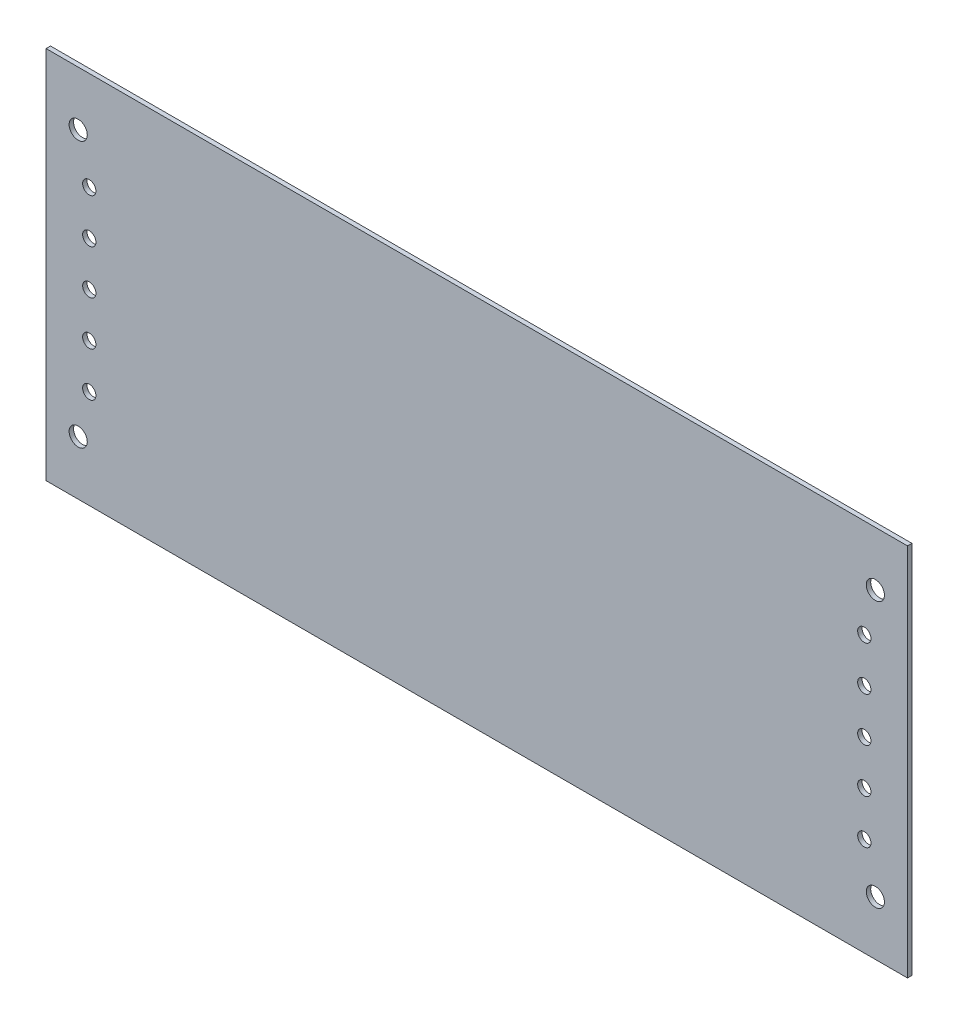
ISO-10303-21;
HEADER;
FILE_DESCRIPTION(('STEP AP214'),'2;1');
FILE_NAME('part.step','',(''),(''),'','','');
FILE_SCHEMA(('AUTOMOTIVE_DESIGN { 1 0 10303 214 1 1 1 1 }'));
ENDSEC;
DATA;
#1=APPLICATION_CONTEXT('core data for automotive mechanical design processes');
#2=APPLICATION_PROTOCOL_DEFINITION('international standard','automotive_design',2000,#1);
#3=PRODUCT_CONTEXT('',#1,'mechanical');
#4=PRODUCT('Part','Part','',(#3));
#5=PRODUCT_RELATED_PRODUCT_CATEGORY('part','',(#4));
#6=PRODUCT_DEFINITION_FORMATION('','',#4);
#7=PRODUCT_DEFINITION_CONTEXT('part definition',#1,'design');
#8=PRODUCT_DEFINITION('design','',#6,#7);
#9=PRODUCT_DEFINITION_SHAPE('','',#8);
#10=(LENGTH_UNIT() NAMED_UNIT(*) SI_UNIT(.MILLI.,.METRE.));
#11=(NAMED_UNIT(*) PLANE_ANGLE_UNIT() SI_UNIT($,.RADIAN.));
#12=(NAMED_UNIT(*) SI_UNIT($,.STERADIAN.) SOLID_ANGLE_UNIT());
#13=UNCERTAINTY_MEASURE_WITH_UNIT(LENGTH_MEASURE(1.E-05),#10,'distance_accuracy_value','');
#14=(GEOMETRIC_REPRESENTATION_CONTEXT(3) GLOBAL_UNCERTAINTY_ASSIGNED_CONTEXT((#13)) GLOBAL_UNIT_ASSIGNED_CONTEXT((#10,
#11,#12)) REPRESENTATION_CONTEXT('',''));
#15=CARTESIAN_POINT('',(0.,0.,0.));
#16=DIRECTION('',(0.,0.,1.));
#17=DIRECTION('',(1.,0.,0.));
#18=AXIS2_PLACEMENT_3D('',#15,#16,#17);
#19=CARTESIAN_POINT('',(-194.5,-84.5,2.));
#20=DIRECTION('',(1.,0.,0.));
#21=DIRECTION('',(0.,0.,-1.));
#22=AXIS2_PLACEMENT_3D('',#19,#20,#21);
#23=PLANE('',#22);
#24=DIRECTION('',(0.,-1.,0.));
#25=VECTOR('',#24,1.);
#26=CARTESIAN_POINT('',(-194.5,-84.5,0.));
#27=LINE('',#26,#25);
#28=CARTESIAN_POINT('',(-194.5,84.5,0.));
#29=VERTEX_POINT('',#28);
#30=CARTESIAN_POINT('',(-194.5,-84.5,0.));
#31=VERTEX_POINT('',#30);
#32=EDGE_CURVE('E110',#29,#31,#27,.T.);
#33=ORIENTED_EDGE('',*,*,#32,.T.);
#34=DIRECTION('',(0.,0.,-1.));
#35=VECTOR('',#34,1.);
#36=CARTESIAN_POINT('',(-194.5,-84.5,2.));
#37=LINE('',#36,#35);
#38=CARTESIAN_POINT('',(-194.5,-84.5,2.));
#39=VERTEX_POINT('',#38);
#40=EDGE_CURVE('E11',#39,#31,#37,.T.);
#41=ORIENTED_EDGE('',*,*,#40,.F.);
#42=DIRECTION('',(0.,-1.,0.));
#43=VECTOR('',#42,1.);
#44=CARTESIAN_POINT('',(-194.5,-84.5,2.));
#45=LINE('',#44,#43);
#46=CARTESIAN_POINT('',(-194.5,84.5,2.));
#47=VERTEX_POINT('',#46);
#48=EDGE_CURVE('E94',#47,#39,#45,.T.);
#49=ORIENTED_EDGE('',*,*,#48,.F.);
#50=DIRECTION('',(0.,0.,-1.));
#51=VECTOR('',#50,1.);
#52=CARTESIAN_POINT('',(-194.5,84.5,2.));
#53=LINE('',#52,#51);
#54=EDGE_CURVE('E106',#47,#29,#53,.T.);
#55=ORIENTED_EDGE('',*,*,#54,.T.);
#56=EDGE_LOOP('',(#33,#41,#49,#55));
#57=FACE_BOUND('',#56,.T.);
#58=ADVANCED_FACE('F42',(#57),#23,.F.);
#59=CARTESIAN_POINT('',(194.5,-84.5,2.));
#60=DIRECTION('',(0.,1.,0.));
#61=DIRECTION('',(-1.,0.,0.));
#62=AXIS2_PLACEMENT_3D('',#59,#60,#61);
#63=PLANE('',#62);
#64=DIRECTION('',(1.,0.,0.));
#65=VECTOR('',#64,1.);
#66=CARTESIAN_POINT('',(194.5,-84.5,0.));
#67=LINE('',#66,#65);
#68=CARTESIAN_POINT('',(194.5,-84.5,0.));
#69=VERTEX_POINT('',#68);
#70=EDGE_CURVE('E99',#31,#69,#67,.T.);
#71=ORIENTED_EDGE('',*,*,#70,.T.);
#72=DIRECTION('',(0.,0.,-1.));
#73=VECTOR('',#72,1.);
#74=CARTESIAN_POINT('',(194.5,-84.5,2.));
#75=LINE('',#74,#73);
#76=CARTESIAN_POINT('',(194.5,-84.5,2.));
#77=VERTEX_POINT('',#76);
#78=EDGE_CURVE('E51',#77,#69,#75,.T.);
#79=ORIENTED_EDGE('',*,*,#78,.F.);
#80=DIRECTION('',(1.,0.,0.));
#81=VECTOR('',#80,1.);
#82=CARTESIAN_POINT('',(194.5,-84.5,2.));
#83=LINE('',#82,#81);
#84=EDGE_CURVE('E89',#39,#77,#83,.T.);
#85=ORIENTED_EDGE('',*,*,#84,.F.);
#86=ORIENTED_EDGE('',*,*,#40,.T.);
#87=EDGE_LOOP('',(#71,#79,#85,#86));
#88=FACE_BOUND('',#87,.T.);
#89=ADVANCED_FACE('F98',(#88),#63,.F.);
#90=CARTESIAN_POINT('',(194.5,-84.5,2.));
#91=DIRECTION('',(-1.,0.,0.));
#92=DIRECTION('',(0.,0.,1.));
#93=AXIS2_PLACEMENT_3D('',#90,#91,#92);
#94=PLANE('',#93);
#95=DIRECTION('',(0.,1.,0.));
#96=VECTOR('',#95,1.);
#97=CARTESIAN_POINT('',(194.5,-84.5,0.));
#98=LINE('',#97,#96);
#99=CARTESIAN_POINT('',(194.5,84.5000000000001,0.));
#100=VERTEX_POINT('',#99);
#101=EDGE_CURVE('E76',#69,#100,#98,.T.);
#102=ORIENTED_EDGE('',*,*,#101,.T.);
#103=DIRECTION('',(0.,0.,-1.));
#104=VECTOR('',#103,1.);
#105=CARTESIAN_POINT('',(194.5,84.5000000000001,2.));
#106=LINE('',#105,#104);
#107=CARTESIAN_POINT('',(194.5,84.5000000000001,2.));
#108=VERTEX_POINT('',#107);
#109=EDGE_CURVE('E101',#108,#100,#106,.T.);
#110=ORIENTED_EDGE('',*,*,#109,.F.);
#111=DIRECTION('',(0.,1.,0.));
#112=VECTOR('',#111,1.);
#113=CARTESIAN_POINT('',(194.5,-84.5,2.));
#114=LINE('',#113,#112);
#115=EDGE_CURVE('E92',#77,#108,#114,.T.);
#116=ORIENTED_EDGE('',*,*,#115,.F.);
#117=ORIENTED_EDGE('',*,*,#78,.T.);
#118=EDGE_LOOP('',(#102,#110,#116,#117));
#119=FACE_BOUND('',#118,.T.);
#120=ADVANCED_FACE('F102',(#119),#94,.F.);
#121=CARTESIAN_POINT('',(194.5,84.5000000000001,2.));
#122=DIRECTION('',(0.,-1.,0.));
#123=DIRECTION('',(1.,0.,0.));
#124=AXIS2_PLACEMENT_3D('',#121,#122,#123);
#125=PLANE('',#124);
#126=DIRECTION('',(-1.,0.,0.));
#127=VECTOR('',#126,1.);
#128=CARTESIAN_POINT('',(194.5,84.5000000000001,0.));
#129=LINE('',#128,#127);
#130=EDGE_CURVE('E82',#100,#29,#129,.T.);
#131=ORIENTED_EDGE('',*,*,#130,.T.);
#132=ORIENTED_EDGE('',*,*,#54,.F.);
#133=DIRECTION('',(-1.,0.,0.));
#134=VECTOR('',#133,1.);
#135=CARTESIAN_POINT('',(194.5,84.5000000000001,2.));
#136=LINE('',#135,#134);
#137=EDGE_CURVE('E59',#108,#47,#136,.T.);
#138=ORIENTED_EDGE('',*,*,#137,.F.);
#139=ORIENTED_EDGE('',*,*,#109,.T.);
#140=EDGE_LOOP('',(#131,#132,#138,#139));
#141=FACE_BOUND('',#140,.T.);
#142=ADVANCED_FACE('F124',(#141),#125,.F.);
#143=CARTESIAN_POINT('',(0.,0.,2.));
#144=DIRECTION('',(0.,0.,1.));
#145=DIRECTION('',(1.,0.,0.));
#146=AXIS2_PLACEMENT_3D('',#143,#144,#145);
#147=PLANE('',#146);
#148=CARTESIAN_POINT('',(175.,40.,2.));
#149=DIRECTION('',(0.,0.,1.));
#150=DIRECTION('',(1.,0.,0.));
#151=AXIS2_PLACEMENT_3D('',#148,#149,#150);
#152=CIRCLE('',#151,2.99999999999999);
#153=CARTESIAN_POINT('',(178.,40.,2.));
#154=VERTEX_POINT('',#153);
#155=EDGE_CURVE('E160',#154,#154,#152,.T.);
#156=ORIENTED_EDGE('',*,*,#155,.F.);
#157=EDGE_LOOP('',(#156));
#158=FACE_BOUND('',#157,.T.);
#159=CARTESIAN_POINT('',(-180.,60.0000000000004,2.));
#160=DIRECTION('',(0.,0.,1.));
#161=DIRECTION('',(1.,0.,0.));
#162=AXIS2_PLACEMENT_3D('',#159,#160,#161);
#163=CIRCLE('',#162,4.09999999999999);
#164=CARTESIAN_POINT('',(-175.9,60.0000000000004,2.));
#165=VERTEX_POINT('',#164);
#166=EDGE_CURVE('E175',#165,#165,#163,.T.);
#167=ORIENTED_EDGE('',*,*,#166,.F.);
#168=EDGE_LOOP('',(#167));
#169=FACE_BOUND('',#168,.T.);
#170=CARTESIAN_POINT('',(180.,60.0000000000004,2.));
#171=DIRECTION('',(0.,0.,1.));
#172=DIRECTION('',(1.,0.,0.));
#173=AXIS2_PLACEMENT_3D('',#170,#171,#172);
#174=CIRCLE('',#173,4.09999999999999);
#175=CARTESIAN_POINT('',(184.1,60.0000000000004,2.));
#176=VERTEX_POINT('',#175);
#177=EDGE_CURVE('E176',#176,#176,#174,.T.);
#178=ORIENTED_EDGE('',*,*,#177,.F.);
#179=EDGE_LOOP('',(#178));
#180=FACE_BOUND('',#179,.T.);
#181=CARTESIAN_POINT('',(-175.,-19.9999999999996,2.));
#182=DIRECTION('',(0.,0.,1.));
#183=DIRECTION('',(1.,0.,0.));
#184=AXIS2_PLACEMENT_3D('',#181,#182,#183);
#185=CIRCLE('',#184,2.99999999999994);
#186=CARTESIAN_POINT('',(-172.,-19.9999999999996,2.));
#187=VERTEX_POINT('',#186);
#188=EDGE_CURVE('E191',#187,#187,#185,.T.);
#189=ORIENTED_EDGE('',*,*,#188,.F.);
#190=EDGE_LOOP('',(#189));
#191=FACE_BOUND('',#190,.T.);
#192=CARTESIAN_POINT('',(175.,0.,2.));
#193=DIRECTION('',(0.,0.,1.));
#194=DIRECTION('',(1.,0.,0.));
#195=AXIS2_PLACEMENT_3D('',#192,#193,#194);
#196=CIRCLE('',#195,2.99999999999999);
#197=CARTESIAN_POINT('',(178.,0.,2.));
#198=VERTEX_POINT('',#197);
#199=EDGE_CURVE('E135',#198,#198,#196,.T.);
#200=ORIENTED_EDGE('',*,*,#199,.F.);
#201=EDGE_LOOP('',(#200));
#202=FACE_BOUND('',#201,.T.);
#203=CARTESIAN_POINT('',(-175.,20.0000000000004,2.));
#204=DIRECTION('',(0.,0.,1.));
#205=DIRECTION('',(1.,0.,0.));
#206=AXIS2_PLACEMENT_3D('',#203,#204,#205);
#207=CIRCLE('',#206,3.00000000000005);
#208=CARTESIAN_POINT('',(-172.,20.0000000000004,2.));
#209=VERTEX_POINT('',#208);
#210=EDGE_CURVE('E143',#209,#209,#207,.T.);
#211=ORIENTED_EDGE('',*,*,#210,.F.);
#212=EDGE_LOOP('',(#211));
#213=FACE_BOUND('',#212,.T.);
#214=CARTESIAN_POINT('',(175.,20.,2.));
#215=DIRECTION('',(0.,0.,1.));
#216=DIRECTION('',(1.,0.,0.));
#217=AXIS2_PLACEMENT_3D('',#214,#215,#216);
#218=CIRCLE('',#217,2.99999999999999);
#219=CARTESIAN_POINT('',(178.,20.,2.));
#220=VERTEX_POINT('',#219);
#221=EDGE_CURVE('E144',#220,#220,#218,.T.);
#222=ORIENTED_EDGE('',*,*,#221,.F.);
#223=EDGE_LOOP('',(#222));
#224=FACE_BOUND('',#223,.T.);
#225=CARTESIAN_POINT('',(-175.,40.0000000000004,2.));
#226=DIRECTION('',(0.,0.,1.));
#227=DIRECTION('',(1.,0.,0.));
#228=AXIS2_PLACEMENT_3D('',#225,#226,#227);
#229=CIRCLE('',#228,2.99999999999999);
#230=CARTESIAN_POINT('',(-172.,40.0000000000004,2.));
#231=VERTEX_POINT('',#230);
#232=EDGE_CURVE('E159',#231,#231,#229,.T.);
#233=ORIENTED_EDGE('',*,*,#232,.F.);
#234=EDGE_LOOP('',(#233));
#235=FACE_BOUND('',#234,.T.);
#236=CARTESIAN_POINT('',(180.,-60.,2.));
#237=DIRECTION('',(0.,0.,1.));
#238=DIRECTION('',(1.,0.,0.));
#239=AXIS2_PLACEMENT_3D('',#236,#237,#238);
#240=CIRCLE('',#239,4.09999999999999);
#241=CARTESIAN_POINT('',(184.1,-60.,2.));
#242=VERTEX_POINT('',#241);
#243=EDGE_CURVE('E224',#242,#242,#240,.T.);
#244=ORIENTED_EDGE('',*,*,#243,.F.);
#245=EDGE_LOOP('',(#244));
#246=FACE_BOUND('',#245,.T.);
#247=CARTESIAN_POINT('',(175.,-20.,2.));
#248=DIRECTION('',(0.,0.,1.));
#249=DIRECTION('',(1.,0.,0.));
#250=AXIS2_PLACEMENT_3D('',#247,#248,#249);
#251=CIRCLE('',#250,2.99999999999999);
#252=CARTESIAN_POINT('',(178.,-20.,2.));
#253=VERTEX_POINT('',#252);
#254=EDGE_CURVE('E192',#253,#253,#251,.T.);
#255=ORIENTED_EDGE('',*,*,#254,.F.);
#256=EDGE_LOOP('',(#255));
#257=FACE_BOUND('',#256,.T.);
#258=CARTESIAN_POINT('',(-175.,-39.9999999999996,2.));
#259=DIRECTION('',(0.,0.,1.));
#260=DIRECTION('',(1.,0.,0.));
#261=AXIS2_PLACEMENT_3D('',#258,#259,#260);
#262=CIRCLE('',#261,2.99999999999999);
#263=CARTESIAN_POINT('',(-172.,-39.9999999999996,2.));
#264=VERTEX_POINT('',#263);
#265=EDGE_CURVE('E207',#264,#264,#262,.T.);
#266=ORIENTED_EDGE('',*,*,#265,.F.);
#267=EDGE_LOOP('',(#266));
#268=FACE_BOUND('',#267,.T.);
#269=CARTESIAN_POINT('',(175.,-40.,2.));
#270=DIRECTION('',(0.,0.,1.));
#271=DIRECTION('',(1.,0.,0.));
#272=AXIS2_PLACEMENT_3D('',#269,#270,#271);
#273=CIRCLE('',#272,2.99999999999999);
#274=CARTESIAN_POINT('',(178.,-40.,2.));
#275=VERTEX_POINT('',#274);
#276=EDGE_CURVE('E208',#275,#275,#273,.T.);
#277=ORIENTED_EDGE('',*,*,#276,.F.);
#278=EDGE_LOOP('',(#277));
#279=FACE_BOUND('',#278,.T.);
#280=CARTESIAN_POINT('',(-180.,-59.9999999999996,2.));
#281=DIRECTION('',(0.,0.,1.));
#282=DIRECTION('',(1.,0.,0.));
#283=AXIS2_PLACEMENT_3D('',#280,#281,#282);
#284=CIRCLE('',#283,4.09999999999999);
#285=CARTESIAN_POINT('',(-175.9,-59.9999999999996,2.));
#286=VERTEX_POINT('',#285);
#287=EDGE_CURVE('E223',#286,#286,#284,.T.);
#288=ORIENTED_EDGE('',*,*,#287,.F.);
#289=EDGE_LOOP('',(#288));
#290=FACE_BOUND('',#289,.T.);
#291=CARTESIAN_POINT('',(-175.,4.02455846426619E-13,2.));
#292=DIRECTION('',(0.,0.,1.));
#293=DIRECTION('',(1.,0.,0.));
#294=AXIS2_PLACEMENT_3D('',#291,#292,#293);
#295=CIRCLE('',#294,2.99999999999994);
#296=CARTESIAN_POINT('',(-172.,4.02455846426619E-13,2.));
#297=VERTEX_POINT('',#296);
#298=EDGE_CURVE('E131',#297,#297,#295,.T.);
#299=ORIENTED_EDGE('',*,*,#298,.F.);
#300=EDGE_LOOP('',(#299));
#301=FACE_BOUND('',#300,.T.);
#302=ORIENTED_EDGE('',*,*,#48,.T.);
#303=ORIENTED_EDGE('',*,*,#84,.T.);
#304=ORIENTED_EDGE('',*,*,#115,.T.);
#305=ORIENTED_EDGE('',*,*,#137,.T.);
#306=EDGE_LOOP('',(#302,#303,#304,#305));
#307=FACE_BOUND('',#306,.T.);
#308=ADVANCED_FACE('F90',(#158,#169,#180,#191,#202,#213,#224,#235,#246,#257,#268,#279,#290,#301,
#307),#147,.T.);
#309=CARTESIAN_POINT('',(0.,0.,0.));
#310=DIRECTION('',(0.,0.,1.));
#311=DIRECTION('',(1.,0.,0.));
#312=AXIS2_PLACEMENT_3D('',#309,#310,#311);
#313=PLANE('',#312);
#314=CARTESIAN_POINT('',(175.,40.,0.));
#315=DIRECTION('',(0.,0.,1.));
#316=DIRECTION('',(1.,0.,0.));
#317=AXIS2_PLACEMENT_3D('',#314,#315,#316);
#318=CIRCLE('',#317,2.99999999999999);
#319=CARTESIAN_POINT('',(178.,40.,0.));
#320=VERTEX_POINT('',#319);
#321=EDGE_CURVE('E180',#320,#320,#318,.T.);
#322=ORIENTED_EDGE('',*,*,#321,.T.);
#323=EDGE_LOOP('',(#322));
#324=FACE_BOUND('',#323,.T.);
#325=CARTESIAN_POINT('',(-180.,60.0000000000004,0.));
#326=DIRECTION('',(0.,0.,1.));
#327=DIRECTION('',(1.,0.,0.));
#328=AXIS2_PLACEMENT_3D('',#325,#326,#327);
#329=CIRCLE('',#328,4.09999999999999);
#330=CARTESIAN_POINT('',(-175.9,60.0000000000004,0.));
#331=VERTEX_POINT('',#330);
#332=EDGE_CURVE('E171',#331,#331,#329,.T.);
#333=ORIENTED_EDGE('',*,*,#332,.T.);
#334=EDGE_LOOP('',(#333));
#335=FACE_BOUND('',#334,.T.);
#336=CARTESIAN_POINT('',(180.,60.0000000000004,0.));
#337=DIRECTION('',(0.,0.,1.));
#338=DIRECTION('',(1.,0.,0.));
#339=AXIS2_PLACEMENT_3D('',#336,#337,#338);
#340=CIRCLE('',#339,4.09999999999999);
#341=CARTESIAN_POINT('',(184.1,60.0000000000004,0.));
#342=VERTEX_POINT('',#341);
#343=EDGE_CURVE('E196',#342,#342,#340,.T.);
#344=ORIENTED_EDGE('',*,*,#343,.T.);
#345=EDGE_LOOP('',(#344));
#346=FACE_BOUND('',#345,.T.);
#347=CARTESIAN_POINT('',(-175.,-19.9999999999996,0.));
#348=DIRECTION('',(0.,0.,1.));
#349=DIRECTION('',(1.,0.,0.));
#350=AXIS2_PLACEMENT_3D('',#347,#348,#349);
#351=CIRCLE('',#350,2.99999999999994);
#352=CARTESIAN_POINT('',(-172.,-19.9999999999996,0.));
#353=VERTEX_POINT('',#352);
#354=EDGE_CURVE('E187',#353,#353,#351,.T.);
#355=ORIENTED_EDGE('',*,*,#354,.T.);
#356=EDGE_LOOP('',(#355));
#357=FACE_BOUND('',#356,.T.);
#358=CARTESIAN_POINT('',(175.,0.,0.));
#359=DIRECTION('',(0.,0.,1.));
#360=DIRECTION('',(1.,0.,0.));
#361=AXIS2_PLACEMENT_3D('',#358,#359,#360);
#362=CIRCLE('',#361,2.99999999999999);
#363=CARTESIAN_POINT('',(178.,0.,0.));
#364=VERTEX_POINT('',#363);
#365=EDGE_CURVE('E148',#364,#364,#362,.T.);
#366=ORIENTED_EDGE('',*,*,#365,.T.);
#367=EDGE_LOOP('',(#366));
#368=FACE_BOUND('',#367,.T.);
#369=CARTESIAN_POINT('',(-175.,20.0000000000004,0.));
#370=DIRECTION('',(0.,0.,1.));
#371=DIRECTION('',(1.,0.,0.));
#372=AXIS2_PLACEMENT_3D('',#369,#370,#371);
#373=CIRCLE('',#372,3.00000000000005);
#374=CARTESIAN_POINT('',(-172.,20.0000000000004,0.));
#375=VERTEX_POINT('',#374);
#376=EDGE_CURVE('E139',#375,#375,#373,.T.);
#377=ORIENTED_EDGE('',*,*,#376,.T.);
#378=EDGE_LOOP('',(#377));
#379=FACE_BOUND('',#378,.T.);
#380=CARTESIAN_POINT('',(175.,20.,0.));
#381=DIRECTION('',(0.,0.,1.));
#382=DIRECTION('',(1.,0.,0.));
#383=AXIS2_PLACEMENT_3D('',#380,#381,#382);
#384=CIRCLE('',#383,2.99999999999999);
#385=CARTESIAN_POINT('',(178.,20.,0.));
#386=VERTEX_POINT('',#385);
#387=EDGE_CURVE('E164',#386,#386,#384,.T.);
#388=ORIENTED_EDGE('',*,*,#387,.T.);
#389=EDGE_LOOP('',(#388));
#390=FACE_BOUND('',#389,.T.);
#391=CARTESIAN_POINT('',(-175.,40.0000000000004,0.));
#392=DIRECTION('',(0.,0.,1.));
#393=DIRECTION('',(1.,0.,0.));
#394=AXIS2_PLACEMENT_3D('',#391,#392,#393);
#395=CIRCLE('',#394,2.99999999999999);
#396=CARTESIAN_POINT('',(-172.,40.0000000000004,0.));
#397=VERTEX_POINT('',#396);
#398=EDGE_CURVE('E155',#397,#397,#395,.T.);
#399=ORIENTED_EDGE('',*,*,#398,.T.);
#400=EDGE_LOOP('',(#399));
#401=FACE_BOUND('',#400,.T.);
#402=CARTESIAN_POINT('',(180.,-60.,0.));
#403=DIRECTION('',(0.,0.,1.));
#404=DIRECTION('',(1.,0.,0.));
#405=AXIS2_PLACEMENT_3D('',#402,#403,#404);
#406=CIRCLE('',#405,4.09999999999999);
#407=CARTESIAN_POINT('',(184.1,-60.,0.));
#408=VERTEX_POINT('',#407);
#409=EDGE_CURVE('E235',#408,#408,#406,.T.);
#410=ORIENTED_EDGE('',*,*,#409,.T.);
#411=EDGE_LOOP('',(#410));
#412=FACE_BOUND('',#411,.T.);
#413=CARTESIAN_POINT('',(175.,-20.,0.));
#414=DIRECTION('',(0.,0.,1.));
#415=DIRECTION('',(1.,0.,0.));
#416=AXIS2_PLACEMENT_3D('',#413,#414,#415);
#417=CIRCLE('',#416,2.99999999999999);
#418=CARTESIAN_POINT('',(178.,-20.,0.));
#419=VERTEX_POINT('',#418);
#420=EDGE_CURVE('E212',#419,#419,#417,.T.);
#421=ORIENTED_EDGE('',*,*,#420,.T.);
#422=EDGE_LOOP('',(#421));
#423=FACE_BOUND('',#422,.T.);
#424=CARTESIAN_POINT('',(-175.,-39.9999999999996,0.));
#425=DIRECTION('',(0.,0.,1.));
#426=DIRECTION('',(1.,0.,0.));
#427=AXIS2_PLACEMENT_3D('',#424,#425,#426);
#428=CIRCLE('',#427,2.99999999999999);
#429=CARTESIAN_POINT('',(-172.,-39.9999999999996,0.));
#430=VERTEX_POINT('',#429);
#431=EDGE_CURVE('E203',#430,#430,#428,.T.);
#432=ORIENTED_EDGE('',*,*,#431,.T.);
#433=EDGE_LOOP('',(#432));
#434=FACE_BOUND('',#433,.T.);
#435=CARTESIAN_POINT('',(175.,-40.,0.));
#436=DIRECTION('',(0.,0.,1.));
#437=DIRECTION('',(1.,0.,0.));
#438=AXIS2_PLACEMENT_3D('',#435,#436,#437);
#439=CIRCLE('',#438,2.99999999999999);
#440=CARTESIAN_POINT('',(178.,-40.,0.));
#441=VERTEX_POINT('',#440);
#442=EDGE_CURVE('E228',#441,#441,#439,.T.);
#443=ORIENTED_EDGE('',*,*,#442,.T.);
#444=EDGE_LOOP('',(#443));
#445=FACE_BOUND('',#444,.T.);
#446=CARTESIAN_POINT('',(-180.,-59.9999999999996,0.));
#447=DIRECTION('',(0.,0.,1.));
#448=DIRECTION('',(1.,0.,0.));
#449=AXIS2_PLACEMENT_3D('',#446,#447,#448);
#450=CIRCLE('',#449,4.09999999999999);
#451=CARTESIAN_POINT('',(-175.9,-59.9999999999996,0.));
#452=VERTEX_POINT('',#451);
#453=EDGE_CURVE('E219',#452,#452,#450,.T.);
#454=ORIENTED_EDGE('',*,*,#453,.T.);
#455=EDGE_LOOP('',(#454));
#456=FACE_BOUND('',#455,.T.);
#457=CARTESIAN_POINT('',(-175.,4.02455846426619E-13,0.));
#458=DIRECTION('',(0.,0.,1.));
#459=DIRECTION('',(1.,0.,0.));
#460=AXIS2_PLACEMENT_3D('',#457,#458,#459);
#461=CIRCLE('',#460,2.99999999999994);
#462=CARTESIAN_POINT('',(-172.,4.02455846426619E-13,0.));
#463=VERTEX_POINT('',#462);
#464=EDGE_CURVE('E114',#463,#463,#461,.T.);
#465=ORIENTED_EDGE('',*,*,#464,.T.);
#466=EDGE_LOOP('',(#465));
#467=FACE_BOUND('',#466,.T.);
#468=ORIENTED_EDGE('',*,*,#32,.F.);
#469=ORIENTED_EDGE('',*,*,#130,.F.);
#470=ORIENTED_EDGE('',*,*,#101,.F.);
#471=ORIENTED_EDGE('',*,*,#70,.F.);
#472=EDGE_LOOP('',(#468,#469,#470,#471));
#473=FACE_BOUND('',#472,.T.);
#474=ADVANCED_FACE('F127',(#324,#335,#346,#357,#368,#379,#390,#401,#412,#423,#434,#445,#456,
#467,#473),#313,.F.);
#475=CARTESIAN_POINT('',(-175.,4.02455846426619E-13,0.));
#476=DIRECTION('',(0.,0.,1.));
#477=DIRECTION('',(1.,0.,0.));
#478=AXIS2_PLACEMENT_3D('',#475,#476,#477);
#479=CYLINDRICAL_SURFACE('',#478,2.99999999999994);
#480=ORIENTED_EDGE('',*,*,#464,.F.);
#481=EDGE_LOOP('',(#480));
#482=FACE_BOUND('',#481,.T.);
#483=ORIENTED_EDGE('',*,*,#298,.T.);
#484=EDGE_LOOP('',(#483));
#485=FACE_BOUND('',#484,.T.);
#486=ADVANCED_FACE('F259',(#482,#485),#479,.F.);
#487=CARTESIAN_POINT('',(-180.,-59.9999999999996,0.));
#488=DIRECTION('',(0.,0.,1.));
#489=DIRECTION('',(1.,0.,0.));
#490=AXIS2_PLACEMENT_3D('',#487,#488,#489);
#491=CYLINDRICAL_SURFACE('',#490,4.09999999999999);
#492=ORIENTED_EDGE('',*,*,#453,.F.);
#493=EDGE_LOOP('',(#492));
#494=FACE_BOUND('',#493,.T.);
#495=ORIENTED_EDGE('',*,*,#287,.T.);
#496=EDGE_LOOP('',(#495));
#497=FACE_BOUND('',#496,.T.);
#498=ADVANCED_FACE('F261',(#494,#497),#491,.F.);
#499=CARTESIAN_POINT('',(175.,-40.,0.));
#500=DIRECTION('',(0.,0.,1.));
#501=DIRECTION('',(1.,0.,0.));
#502=AXIS2_PLACEMENT_3D('',#499,#500,#501);
#503=CYLINDRICAL_SURFACE('',#502,2.99999999999999);
#504=ORIENTED_EDGE('',*,*,#442,.F.);
#505=EDGE_LOOP('',(#504));
#506=FACE_BOUND('',#505,.T.);
#507=ORIENTED_EDGE('',*,*,#276,.T.);
#508=EDGE_LOOP('',(#507));
#509=FACE_BOUND('',#508,.T.);
#510=ADVANCED_FACE('F268',(#506,#509),#503,.F.);
#511=CARTESIAN_POINT('',(-175.,-39.9999999999996,0.));
#512=DIRECTION('',(0.,0.,1.));
#513=DIRECTION('',(1.,0.,0.));
#514=AXIS2_PLACEMENT_3D('',#511,#512,#513);
#515=CYLINDRICAL_SURFACE('',#514,2.99999999999999);
#516=ORIENTED_EDGE('',*,*,#431,.F.);
#517=EDGE_LOOP('',(#516));
#518=FACE_BOUND('',#517,.T.);
#519=ORIENTED_EDGE('',*,*,#265,.T.);
#520=EDGE_LOOP('',(#519));
#521=FACE_BOUND('',#520,.T.);
#522=ADVANCED_FACE('F319',(#518,#521),#515,.F.);
#523=CARTESIAN_POINT('',(175.,-20.,0.));
#524=DIRECTION('',(0.,0.,1.));
#525=DIRECTION('',(1.,0.,0.));
#526=AXIS2_PLACEMENT_3D('',#523,#524,#525);
#527=CYLINDRICAL_SURFACE('',#526,2.99999999999999);
#528=ORIENTED_EDGE('',*,*,#420,.F.);
#529=EDGE_LOOP('',(#528));
#530=FACE_BOUND('',#529,.T.);
#531=ORIENTED_EDGE('',*,*,#254,.T.);
#532=EDGE_LOOP('',(#531));
#533=FACE_BOUND('',#532,.T.);
#534=ADVANCED_FACE('F330',(#530,#533),#527,.F.);
#535=CARTESIAN_POINT('',(180.,-60.,0.));
#536=DIRECTION('',(0.,0.,1.));
#537=DIRECTION('',(1.,0.,0.));
#538=AXIS2_PLACEMENT_3D('',#535,#536,#537);
#539=CYLINDRICAL_SURFACE('',#538,4.09999999999999);
#540=ORIENTED_EDGE('',*,*,#409,.F.);
#541=EDGE_LOOP('',(#540));
#542=FACE_BOUND('',#541,.T.);
#543=ORIENTED_EDGE('',*,*,#243,.T.);
#544=EDGE_LOOP('',(#543));
#545=FACE_BOUND('',#544,.T.);
#546=ADVANCED_FACE('F243',(#542,#545),#539,.F.);
#547=CARTESIAN_POINT('',(-175.,40.0000000000004,0.));
#548=DIRECTION('',(0.,0.,1.));
#549=DIRECTION('',(1.,0.,0.));
#550=AXIS2_PLACEMENT_3D('',#547,#548,#549);
#551=CYLINDRICAL_SURFACE('',#550,2.99999999999999);
#552=ORIENTED_EDGE('',*,*,#398,.F.);
#553=EDGE_LOOP('',(#552));
#554=FACE_BOUND('',#553,.T.);
#555=ORIENTED_EDGE('',*,*,#232,.T.);
#556=EDGE_LOOP('',(#555));
#557=FACE_BOUND('',#556,.T.);
#558=ADVANCED_FACE('F351',(#554,#557),#551,.F.);
#559=CARTESIAN_POINT('',(175.,20.,0.));
#560=DIRECTION('',(0.,0.,1.));
#561=DIRECTION('',(1.,0.,0.));
#562=AXIS2_PLACEMENT_3D('',#559,#560,#561);
#563=CYLINDRICAL_SURFACE('',#562,2.99999999999999);
#564=ORIENTED_EDGE('',*,*,#387,.F.);
#565=EDGE_LOOP('',(#564));
#566=FACE_BOUND('',#565,.T.);
#567=ORIENTED_EDGE('',*,*,#221,.T.);
#568=EDGE_LOOP('',(#567));
#569=FACE_BOUND('',#568,.T.);
#570=ADVANCED_FACE('F362',(#566,#569),#563,.F.);
#571=CARTESIAN_POINT('',(-175.,20.0000000000004,0.));
#572=DIRECTION('',(0.,0.,1.));
#573=DIRECTION('',(1.,0.,0.));
#574=AXIS2_PLACEMENT_3D('',#571,#572,#573);
#575=CYLINDRICAL_SURFACE('',#574,3.00000000000005);
#576=ORIENTED_EDGE('',*,*,#376,.F.);
#577=EDGE_LOOP('',(#576));
#578=FACE_BOUND('',#577,.T.);
#579=ORIENTED_EDGE('',*,*,#210,.T.);
#580=EDGE_LOOP('',(#579));
#581=FACE_BOUND('',#580,.T.);
#582=ADVANCED_FACE('F373',(#578,#581),#575,.F.);
#583=CARTESIAN_POINT('',(175.,0.,0.));
#584=DIRECTION('',(0.,0.,1.));
#585=DIRECTION('',(1.,0.,0.));
#586=AXIS2_PLACEMENT_3D('',#583,#584,#585);
#587=CYLINDRICAL_SURFACE('',#586,2.99999999999999);
#588=ORIENTED_EDGE('',*,*,#365,.F.);
#589=EDGE_LOOP('',(#588));
#590=FACE_BOUND('',#589,.T.);
#591=ORIENTED_EDGE('',*,*,#199,.T.);
#592=EDGE_LOOP('',(#591));
#593=FACE_BOUND('',#592,.T.);
#594=ADVANCED_FACE('F384',(#590,#593),#587,.F.);
#595=CARTESIAN_POINT('',(-175.,-19.9999999999996,0.));
#596=DIRECTION('',(0.,0.,1.));
#597=DIRECTION('',(1.,0.,0.));
#598=AXIS2_PLACEMENT_3D('',#595,#596,#597);
#599=CYLINDRICAL_SURFACE('',#598,2.99999999999994);
#600=ORIENTED_EDGE('',*,*,#354,.F.);
#601=EDGE_LOOP('',(#600));
#602=FACE_BOUND('',#601,.T.);
#603=ORIENTED_EDGE('',*,*,#188,.T.);
#604=EDGE_LOOP('',(#603));
#605=FACE_BOUND('',#604,.T.);
#606=ADVANCED_FACE('F394',(#602,#605),#599,.F.);
#607=CARTESIAN_POINT('',(180.,60.0000000000004,0.));
#608=DIRECTION('',(0.,0.,1.));
#609=DIRECTION('',(1.,0.,0.));
#610=AXIS2_PLACEMENT_3D('',#607,#608,#609);
#611=CYLINDRICAL_SURFACE('',#610,4.09999999999999);
#612=ORIENTED_EDGE('',*,*,#343,.F.);
#613=EDGE_LOOP('',(#612));
#614=FACE_BOUND('',#613,.T.);
#615=ORIENTED_EDGE('',*,*,#177,.T.);
#616=EDGE_LOOP('',(#615));
#617=FACE_BOUND('',#616,.T.);
#618=ADVANCED_FACE('F405',(#614,#617),#611,.F.);
#619=CARTESIAN_POINT('',(-180.,60.0000000000004,0.));
#620=DIRECTION('',(0.,0.,1.));
#621=DIRECTION('',(1.,0.,0.));
#622=AXIS2_PLACEMENT_3D('',#619,#620,#621);
#623=CYLINDRICAL_SURFACE('',#622,4.09999999999999);
#624=ORIENTED_EDGE('',*,*,#332,.F.);
#625=EDGE_LOOP('',(#624));
#626=FACE_BOUND('',#625,.T.);
#627=ORIENTED_EDGE('',*,*,#166,.T.);
#628=EDGE_LOOP('',(#627));
#629=FACE_BOUND('',#628,.T.);
#630=ADVANCED_FACE('F416',(#626,#629),#623,.F.);
#631=CARTESIAN_POINT('',(175.,40.,0.));
#632=DIRECTION('',(0.,0.,1.));
#633=DIRECTION('',(1.,0.,0.));
#634=AXIS2_PLACEMENT_3D('',#631,#632,#633);
#635=CYLINDRICAL_SURFACE('',#634,2.99999999999999);
#636=ORIENTED_EDGE('',*,*,#321,.F.);
#637=EDGE_LOOP('',(#636));
#638=FACE_BOUND('',#637,.T.);
#639=ORIENTED_EDGE('',*,*,#155,.T.);
#640=EDGE_LOOP('',(#639));
#641=FACE_BOUND('',#640,.T.);
#642=ADVANCED_FACE('F427',(#638,#641),#635,.F.);
#643=CLOSED_SHELL('',(#58,#89,#120,#142,#308,#474,#486,#498,#510,#522,#534,#546,#558,#570,#582,
#594,#606,#618,#630,#642));
#644=MANIFOLD_SOLID_BREP('B2',#643);
#645=ADVANCED_BREP_SHAPE_REPRESENTATION('',(#18,#644),#14);
#646=SHAPE_DEFINITION_REPRESENTATION(#9,#645);
ENDSEC;
END-ISO-10303-21;
